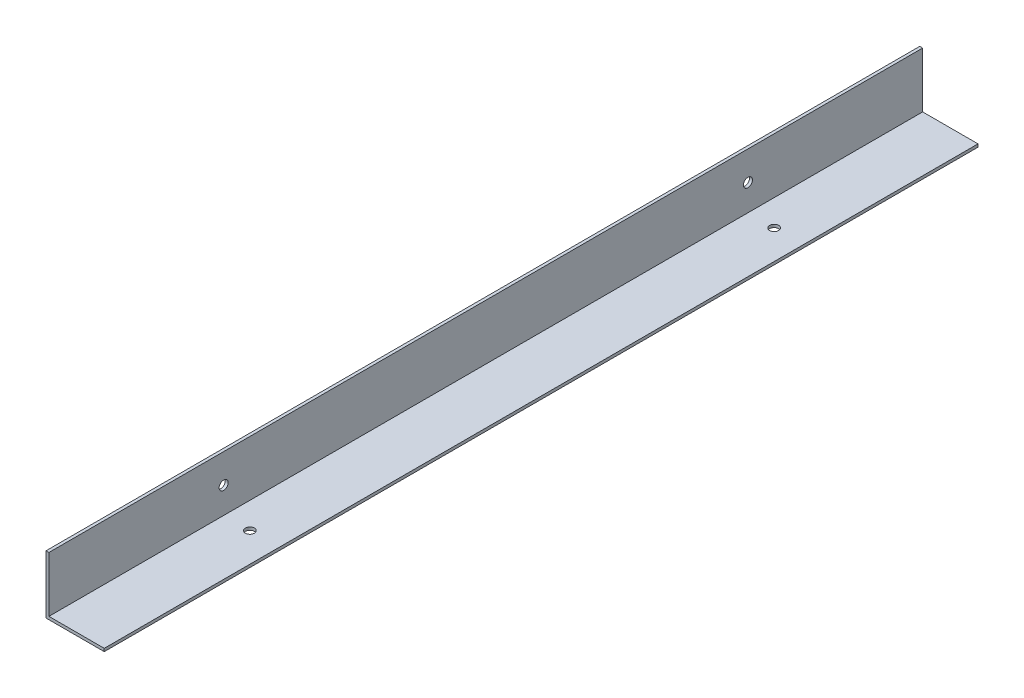
ISO-10303-21;
HEADER;
FILE_DESCRIPTION(('STEP AP214'),'2;1');
FILE_NAME('part.step','',(''),(''),'','','');
FILE_SCHEMA(('AUTOMOTIVE_DESIGN { 1 0 10303 214 1 1 1 1 }'));
ENDSEC;
DATA;
#1=APPLICATION_CONTEXT('core data for automotive mechanical design processes');
#2=APPLICATION_PROTOCOL_DEFINITION('international standard','automotive_design',2000,#1);
#3=PRODUCT_CONTEXT('',#1,'mechanical');
#4=PRODUCT('Part','Part','',(#3));
#5=PRODUCT_RELATED_PRODUCT_CATEGORY('part','',(#4));
#6=PRODUCT_DEFINITION_FORMATION('','',#4);
#7=PRODUCT_DEFINITION_CONTEXT('part definition',#1,'design');
#8=PRODUCT_DEFINITION('design','',#6,#7);
#9=PRODUCT_DEFINITION_SHAPE('','',#8);
#10=(LENGTH_UNIT() NAMED_UNIT(*) SI_UNIT(.MILLI.,.METRE.));
#11=(NAMED_UNIT(*) PLANE_ANGLE_UNIT() SI_UNIT($,.RADIAN.));
#12=(NAMED_UNIT(*) SI_UNIT($,.STERADIAN.) SOLID_ANGLE_UNIT());
#13=UNCERTAINTY_MEASURE_WITH_UNIT(LENGTH_MEASURE(1.E-05),#10,'distance_accuracy_value','');
#14=(GEOMETRIC_REPRESENTATION_CONTEXT(3) GLOBAL_UNCERTAINTY_ASSIGNED_CONTEXT((#13)) GLOBAL_UNIT_ASSIGNED_CONTEXT((#10,
#11,#12)) REPRESENTATION_CONTEXT('',''));
#15=CARTESIAN_POINT('',(0.,0.,0.));
#16=DIRECTION('',(0.,0.,1.));
#17=DIRECTION('',(1.,0.,0.));
#18=AXIS2_PLACEMENT_3D('',#15,#16,#17);
#19=CARTESIAN_POINT('',(31.75,0.,476.25));
#20=DIRECTION('',(0.,1.,0.));
#21=DIRECTION('',(-1.,0.,0.));
#22=AXIS2_PLACEMENT_3D('',#19,#20,#21);
#23=PLANE('',#22);
#24=CARTESIAN_POINT('',(15.875,0.,95.25));
#25=DIRECTION('',(0.,-1.,0.));
#26=DIRECTION('',(0.,0.,-1.));
#27=AXIS2_PLACEMENT_3D('',#24,#25,#26);
#28=CIRCLE('',#27,2.45744999999999);
#29=CARTESIAN_POINT('',(15.875,0.,92.79255));
#30=VERTEX_POINT('',#29);
#31=EDGE_CURVE('E165',#30,#30,#28,.T.);
#32=ORIENTED_EDGE('',*,*,#31,.F.);
#33=EDGE_LOOP('',(#32));
#34=FACE_BOUND('',#33,.T.);
#35=CARTESIAN_POINT('',(15.875,0.,381.));
#36=DIRECTION('',(0.,-1.,0.));
#37=DIRECTION('',(0.,0.,-1.));
#38=AXIS2_PLACEMENT_3D('',#35,#36,#37);
#39=CIRCLE('',#38,2.45744999999999);
#40=CARTESIAN_POINT('',(15.875,0.,378.54255));
#41=VERTEX_POINT('',#40);
#42=EDGE_CURVE('E168',#41,#41,#39,.T.);
#43=ORIENTED_EDGE('',*,*,#42,.F.);
#44=EDGE_LOOP('',(#43));
#45=FACE_BOUND('',#44,.T.);
#46=DIRECTION('',(1.,0.,0.));
#47=VECTOR('',#46,1.);
#48=CARTESIAN_POINT('',(31.75,0.,0.));
#49=LINE('',#48,#47);
#50=CARTESIAN_POINT('',(0.,0.,0.));
#51=VERTEX_POINT('',#50);
#52=CARTESIAN_POINT('',(31.75,0.,0.));
#53=VERTEX_POINT('',#52);
#54=EDGE_CURVE('E118',#51,#53,#49,.T.);
#55=ORIENTED_EDGE('',*,*,#54,.T.);
#56=DIRECTION('',(0.,0.,-1.));
#57=VECTOR('',#56,1.);
#58=CARTESIAN_POINT('',(31.75,0.,476.25));
#59=LINE('',#58,#57);
#60=CARTESIAN_POINT('',(31.75,0.,476.25));
#61=VERTEX_POINT('',#60);
#62=EDGE_CURVE('E11',#61,#53,#59,.T.);
#63=ORIENTED_EDGE('',*,*,#62,.F.);
#64=DIRECTION('',(1.,0.,0.));
#65=VECTOR('',#64,1.);
#66=CARTESIAN_POINT('',(31.75,0.,476.25));
#67=LINE('',#66,#65);
#68=CARTESIAN_POINT('',(0.,0.,476.25));
#69=VERTEX_POINT('',#68);
#70=EDGE_CURVE('E129',#69,#61,#67,.T.);
#71=ORIENTED_EDGE('',*,*,#70,.F.);
#72=DIRECTION('',(0.,0.,-1.));
#73=VECTOR('',#72,1.);
#74=CARTESIAN_POINT('',(0.,0.,476.25));
#75=LINE('',#74,#73);
#76=EDGE_CURVE('E114',#69,#51,#75,.T.);
#77=ORIENTED_EDGE('',*,*,#76,.T.);
#78=EDGE_LOOP('',(#55,#63,#71,#77));
#79=FACE_BOUND('',#78,.T.);
#80=ADVANCED_FACE('F33',(#34,#45,#79),#23,.F.);
#81=CARTESIAN_POINT('',(31.75,1.5875,476.25));
#82=DIRECTION('',(-1.,0.,0.));
#83=DIRECTION('',(0.,0.,1.));
#84=AXIS2_PLACEMENT_3D('',#81,#82,#83);
#85=PLANE('',#84);
#86=DIRECTION('',(0.,1.,0.));
#87=VECTOR('',#86,1.);
#88=CARTESIAN_POINT('',(31.75,1.5875,0.));
#89=LINE('',#88,#87);
#90=CARTESIAN_POINT('',(31.75,1.5875,0.));
#91=VERTEX_POINT('',#90);
#92=EDGE_CURVE('E121',#53,#91,#89,.T.);
#93=ORIENTED_EDGE('',*,*,#92,.T.);
#94=DIRECTION('',(0.,0.,-1.));
#95=VECTOR('',#94,1.);
#96=CARTESIAN_POINT('',(31.75,1.5875,476.25));
#97=LINE('',#96,#95);
#98=CARTESIAN_POINT('',(31.75,1.5875,476.25));
#99=VERTEX_POINT('',#98);
#100=EDGE_CURVE('E42',#99,#91,#97,.T.);
#101=ORIENTED_EDGE('',*,*,#100,.F.);
#102=DIRECTION('',(0.,1.,0.));
#103=VECTOR('',#102,1.);
#104=CARTESIAN_POINT('',(31.75,1.5875,476.25));
#105=LINE('',#104,#103);
#106=EDGE_CURVE('E87',#61,#99,#105,.T.);
#107=ORIENTED_EDGE('',*,*,#106,.F.);
#108=ORIENTED_EDGE('',*,*,#62,.T.);
#109=EDGE_LOOP('',(#93,#101,#107,#108));
#110=FACE_BOUND('',#109,.T.);
#111=ADVANCED_FACE('F157',(#110),#85,.F.);
#112=CARTESIAN_POINT('',(1.5875,1.5875,476.25));
#113=DIRECTION('',(0.,-1.,0.));
#114=DIRECTION('',(0.,0.,-1.));
#115=AXIS2_PLACEMENT_3D('',#112,#113,#114);
#116=PLANE('',#115);
#117=CARTESIAN_POINT('',(15.875,1.5875,95.25));
#118=DIRECTION('',(0.,-1.,0.));
#119=DIRECTION('',(0.,0.,-1.));
#120=AXIS2_PLACEMENT_3D('',#117,#118,#119);
#121=CIRCLE('',#120,2.45744999999999);
#122=CARTESIAN_POINT('',(15.875,1.5875,92.79255));
#123=VERTEX_POINT('',#122);
#124=EDGE_CURVE('E36',#123,#123,#121,.T.);
#125=ORIENTED_EDGE('',*,*,#124,.T.);
#126=EDGE_LOOP('',(#125));
#127=FACE_BOUND('',#126,.T.);
#128=CARTESIAN_POINT('',(15.875,1.5875,381.));
#129=DIRECTION('',(0.,-1.,0.));
#130=DIRECTION('',(0.,0.,-1.));
#131=AXIS2_PLACEMENT_3D('',#128,#129,#130);
#132=CIRCLE('',#131,2.45744999999999);
#133=CARTESIAN_POINT('',(15.875,1.5875,378.54255));
#134=VERTEX_POINT('',#133);
#135=EDGE_CURVE('E170',#134,#134,#132,.T.);
#136=ORIENTED_EDGE('',*,*,#135,.T.);
#137=EDGE_LOOP('',(#136));
#138=FACE_BOUND('',#137,.T.);
#139=DIRECTION('',(-1.,0.,0.));
#140=VECTOR('',#139,1.);
#141=CARTESIAN_POINT('',(1.5875,1.5875,0.));
#142=LINE('',#141,#140);
#143=CARTESIAN_POINT('',(1.5875,1.5875,0.));
#144=VERTEX_POINT('',#143);
#145=EDGE_CURVE('E124',#91,#144,#142,.T.);
#146=ORIENTED_EDGE('',*,*,#145,.T.);
#147=DIRECTION('',(0.,0.,-1.));
#148=VECTOR('',#147,1.);
#149=CARTESIAN_POINT('',(1.5875,1.5875,476.25));
#150=LINE('',#149,#148);
#151=CARTESIAN_POINT('',(1.5875,1.5875,476.25));
#152=VERTEX_POINT('',#151);
#153=EDGE_CURVE('E109',#152,#144,#150,.T.);
#154=ORIENTED_EDGE('',*,*,#153,.F.);
#155=DIRECTION('',(-1.,0.,0.));
#156=VECTOR('',#155,1.);
#157=CARTESIAN_POINT('',(1.5875,1.5875,476.25));
#158=LINE('',#157,#156);
#159=EDGE_CURVE('E100',#99,#152,#158,.T.);
#160=ORIENTED_EDGE('',*,*,#159,.F.);
#161=ORIENTED_EDGE('',*,*,#100,.T.);
#162=EDGE_LOOP('',(#146,#154,#160,#161));
#163=FACE_BOUND('',#162,.T.);
#164=ADVANCED_FACE('F136',(#127,#138,#163),#116,.F.);
#165=CARTESIAN_POINT('',(1.5875,31.75,476.25));
#166=DIRECTION('',(-1.,0.,0.));
#167=DIRECTION('',(0.,-1.,0.));
#168=AXIS2_PLACEMENT_3D('',#165,#166,#167);
#169=PLANE('',#168);
#170=CARTESIAN_POINT('',(1.5875,15.875,381.));
#171=DIRECTION('',(-1.,0.,0.));
#172=DIRECTION('',(0.,-1.,0.));
#173=AXIS2_PLACEMENT_3D('',#170,#171,#172);
#174=CIRCLE('',#173,2.45744999999999);
#175=CARTESIAN_POINT('',(1.5875,13.41755,381.));
#176=VERTEX_POINT('',#175);
#177=EDGE_CURVE('E180',#176,#176,#174,.T.);
#178=ORIENTED_EDGE('',*,*,#177,.T.);
#179=EDGE_LOOP('',(#178));
#180=FACE_BOUND('',#179,.T.);
#181=CARTESIAN_POINT('',(1.5875,15.875,95.25));
#182=DIRECTION('',(-1.,0.,0.));
#183=DIRECTION('',(0.,-1.,0.));
#184=AXIS2_PLACEMENT_3D('',#181,#182,#183);
#185=CIRCLE('',#184,2.45744999999999);
#186=CARTESIAN_POINT('',(1.5875,13.41755,95.25));
#187=VERTEX_POINT('',#186);
#188=EDGE_CURVE('E122',#187,#187,#185,.T.);
#189=ORIENTED_EDGE('',*,*,#188,.T.);
#190=EDGE_LOOP('',(#189));
#191=FACE_BOUND('',#190,.T.);
#192=DIRECTION('',(0.,1.,0.));
#193=VECTOR('',#192,1.);
#194=CARTESIAN_POINT('',(1.5875,31.75,0.));
#195=LINE('',#194,#193);
#196=CARTESIAN_POINT('',(1.5875,31.75,0.));
#197=VERTEX_POINT('',#196);
#198=EDGE_CURVE('E108',#144,#197,#195,.T.);
#199=ORIENTED_EDGE('',*,*,#198,.T.);
#200=DIRECTION('',(0.,0.,-1.));
#201=VECTOR('',#200,1.);
#202=CARTESIAN_POINT('',(1.5875,31.75,476.25));
#203=LINE('',#202,#201);
#204=CARTESIAN_POINT('',(1.5875,31.75,476.25));
#205=VERTEX_POINT('',#204);
#206=EDGE_CURVE('E105',#205,#197,#203,.T.);
#207=ORIENTED_EDGE('',*,*,#206,.F.);
#208=DIRECTION('',(0.,1.,0.));
#209=VECTOR('',#208,1.);
#210=CARTESIAN_POINT('',(1.5875,31.75,476.25));
#211=LINE('',#210,#209);
#212=EDGE_CURVE('E94',#152,#205,#211,.T.);
#213=ORIENTED_EDGE('',*,*,#212,.F.);
#214=ORIENTED_EDGE('',*,*,#153,.T.);
#215=EDGE_LOOP('',(#199,#207,#213,#214));
#216=FACE_BOUND('',#215,.T.);
#217=ADVANCED_FACE('F106',(#180,#191,#216),#169,.F.);
#218=CARTESIAN_POINT('',(0.,31.75,476.25));
#219=DIRECTION('',(0.,-1.,0.));
#220=DIRECTION('',(0.,0.,-1.));
#221=AXIS2_PLACEMENT_3D('',#218,#219,#220);
#222=PLANE('',#221);
#223=DIRECTION('',(-1.,0.,0.));
#224=VECTOR('',#223,1.);
#225=CARTESIAN_POINT('',(0.,31.75,0.));
#226=LINE('',#225,#224);
#227=CARTESIAN_POINT('',(0.,31.75,0.));
#228=VERTEX_POINT('',#227);
#229=EDGE_CURVE('E73',#197,#228,#226,.T.);
#230=ORIENTED_EDGE('',*,*,#229,.T.);
#231=DIRECTION('',(0.,0.,-1.));
#232=VECTOR('',#231,1.);
#233=CARTESIAN_POINT('',(0.,31.75,476.25));
#234=LINE('',#233,#232);
#235=CARTESIAN_POINT('',(0.,31.75,476.25));
#236=VERTEX_POINT('',#235);
#237=EDGE_CURVE('E110',#236,#228,#234,.T.);
#238=ORIENTED_EDGE('',*,*,#237,.F.);
#239=DIRECTION('',(-1.,0.,0.));
#240=VECTOR('',#239,1.);
#241=CARTESIAN_POINT('',(0.,31.75,476.25));
#242=LINE('',#241,#240);
#243=EDGE_CURVE('E98',#205,#236,#242,.T.);
#244=ORIENTED_EDGE('',*,*,#243,.F.);
#245=ORIENTED_EDGE('',*,*,#206,.T.);
#246=EDGE_LOOP('',(#230,#238,#244,#245));
#247=FACE_BOUND('',#246,.T.);
#248=ADVANCED_FACE('F112',(#247),#222,.F.);
#249=CARTESIAN_POINT('',(0.,0.,476.25));
#250=DIRECTION('',(1.,0.,0.));
#251=DIRECTION('',(0.,0.,-1.));
#252=AXIS2_PLACEMENT_3D('',#249,#250,#251);
#253=PLANE('',#252);
#254=CARTESIAN_POINT('',(0.,15.875,381.));
#255=DIRECTION('',(-1.,0.,0.));
#256=DIRECTION('',(0.,0.,1.));
#257=AXIS2_PLACEMENT_3D('',#254,#255,#256);
#258=CIRCLE('',#257,2.45744999999999);
#259=CARTESIAN_POINT('',(0.,15.875,383.45745));
#260=VERTEX_POINT('',#259);
#261=EDGE_CURVE('E173',#260,#260,#258,.T.);
#262=ORIENTED_EDGE('',*,*,#261,.F.);
#263=EDGE_LOOP('',(#262));
#264=FACE_BOUND('',#263,.T.);
#265=CARTESIAN_POINT('',(0.,15.875,95.25));
#266=DIRECTION('',(-1.,0.,0.));
#267=DIRECTION('',(0.,0.,1.));
#268=AXIS2_PLACEMENT_3D('',#265,#266,#267);
#269=CIRCLE('',#268,2.45744999999999);
#270=CARTESIAN_POINT('',(0.,15.875,97.70745));
#271=VERTEX_POINT('',#270);
#272=EDGE_CURVE('E183',#271,#271,#269,.T.);
#273=ORIENTED_EDGE('',*,*,#272,.F.);
#274=EDGE_LOOP('',(#273));
#275=FACE_BOUND('',#274,.T.);
#276=DIRECTION('',(0.,-1.,0.));
#277=VECTOR('',#276,1.);
#278=CARTESIAN_POINT('',(0.,0.,0.));
#279=LINE('',#278,#277);
#280=EDGE_CURVE('E79',#228,#51,#279,.T.);
#281=ORIENTED_EDGE('',*,*,#280,.T.);
#282=ORIENTED_EDGE('',*,*,#76,.F.);
#283=DIRECTION('',(0.,-1.,0.));
#284=VECTOR('',#283,1.);
#285=CARTESIAN_POINT('',(0.,0.,476.25));
#286=LINE('',#285,#284);
#287=EDGE_CURVE('E50',#236,#69,#286,.T.);
#288=ORIENTED_EDGE('',*,*,#287,.F.);
#289=ORIENTED_EDGE('',*,*,#237,.T.);
#290=EDGE_LOOP('',(#281,#282,#288,#289));
#291=FACE_BOUND('',#290,.T.);
#292=ADVANCED_FACE('F143',(#264,#275,#291),#253,.F.);
#293=CARTESIAN_POINT('',(0.,0.,476.25));
#294=DIRECTION('',(0.,0.,-1.));
#295=DIRECTION('',(-1.,0.,0.));
#296=AXIS2_PLACEMENT_3D('',#293,#294,#295);
#297=PLANE('',#296);
#298=ORIENTED_EDGE('',*,*,#70,.T.);
#299=ORIENTED_EDGE('',*,*,#106,.T.);
#300=ORIENTED_EDGE('',*,*,#159,.T.);
#301=ORIENTED_EDGE('',*,*,#212,.T.);
#302=ORIENTED_EDGE('',*,*,#243,.T.);
#303=ORIENTED_EDGE('',*,*,#287,.T.);
#304=EDGE_LOOP('',(#298,#299,#300,#301,#302,#303));
#305=FACE_BOUND('',#304,.T.);
#306=ADVANCED_FACE('F96',(#305),#297,.F.);
#307=CARTESIAN_POINT('',(0.,0.,0.));
#308=DIRECTION('',(0.,0.,-1.));
#309=DIRECTION('',(-1.,0.,0.));
#310=AXIS2_PLACEMENT_3D('',#307,#308,#309);
#311=PLANE('',#310);
#312=ORIENTED_EDGE('',*,*,#54,.F.);
#313=ORIENTED_EDGE('',*,*,#280,.F.);
#314=ORIENTED_EDGE('',*,*,#229,.F.);
#315=ORIENTED_EDGE('',*,*,#198,.F.);
#316=ORIENTED_EDGE('',*,*,#145,.F.);
#317=ORIENTED_EDGE('',*,*,#92,.F.);
#318=EDGE_LOOP('',(#312,#313,#314,#315,#316,#317));
#319=FACE_BOUND('',#318,.T.);
#320=ADVANCED_FACE('F139',(#319),#311,.T.);
#321=CARTESIAN_POINT('',(0.,15.875,95.25));
#322=DIRECTION('',(-1.,0.,0.));
#323=DIRECTION('',(0.,0.,1.));
#324=AXIS2_PLACEMENT_3D('',#321,#322,#323);
#325=CYLINDRICAL_SURFACE('',#324,2.45744999999999);
#326=ORIENTED_EDGE('',*,*,#272,.T.);
#327=EDGE_LOOP('',(#326));
#328=FACE_BOUND('',#327,.T.);
#329=ORIENTED_EDGE('',*,*,#188,.F.);
#330=EDGE_LOOP('',(#329));
#331=FACE_BOUND('',#330,.T.);
#332=ADVANCED_FACE('F192',(#328,#331),#325,.F.);
#333=CARTESIAN_POINT('',(0.,15.875,381.));
#334=DIRECTION('',(-1.,0.,0.));
#335=DIRECTION('',(0.,0.,1.));
#336=AXIS2_PLACEMENT_3D('',#333,#334,#335);
#337=CYLINDRICAL_SURFACE('',#336,2.45744999999999);
#338=ORIENTED_EDGE('',*,*,#261,.T.);
#339=EDGE_LOOP('',(#338));
#340=FACE_BOUND('',#339,.T.);
#341=ORIENTED_EDGE('',*,*,#177,.F.);
#342=EDGE_LOOP('',(#341));
#343=FACE_BOUND('',#342,.T.);
#344=ADVANCED_FACE('F194',(#340,#343),#337,.F.);
#345=CARTESIAN_POINT('',(15.875,0.,381.));
#346=DIRECTION('',(0.,-1.,0.));
#347=DIRECTION('',(0.,0.,-1.));
#348=AXIS2_PLACEMENT_3D('',#345,#346,#347);
#349=CYLINDRICAL_SURFACE('',#348,2.45744999999999);
#350=ORIENTED_EDGE('',*,*,#42,.T.);
#351=EDGE_LOOP('',(#350));
#352=FACE_BOUND('',#351,.T.);
#353=ORIENTED_EDGE('',*,*,#135,.F.);
#354=EDGE_LOOP('',(#353));
#355=FACE_BOUND('',#354,.T.);
#356=ADVANCED_FACE('F201',(#352,#355),#349,.F.);
#357=CARTESIAN_POINT('',(15.875,0.,95.25));
#358=DIRECTION('',(0.,-1.,0.));
#359=DIRECTION('',(0.,0.,-1.));
#360=AXIS2_PLACEMENT_3D('',#357,#358,#359);
#361=CYLINDRICAL_SURFACE('',#360,2.45744999999999);
#362=ORIENTED_EDGE('',*,*,#31,.T.);
#363=EDGE_LOOP('',(#362));
#364=FACE_BOUND('',#363,.T.);
#365=ORIENTED_EDGE('',*,*,#124,.F.);
#366=EDGE_LOOP('',(#365));
#367=FACE_BOUND('',#366,.T.);
#368=ADVANCED_FACE('F207',(#364,#367),#361,.F.);
#369=CLOSED_SHELL('',(#80,#111,#164,#217,#248,#292,#306,#320,#332,#344,#356,#368));
#370=MANIFOLD_SOLID_BREP('B2',#369);
#371=ADVANCED_BREP_SHAPE_REPRESENTATION('',(#18,#370),#14);
#372=SHAPE_DEFINITION_REPRESENTATION(#9,#371);
ENDSEC;
END-ISO-10303-21;
